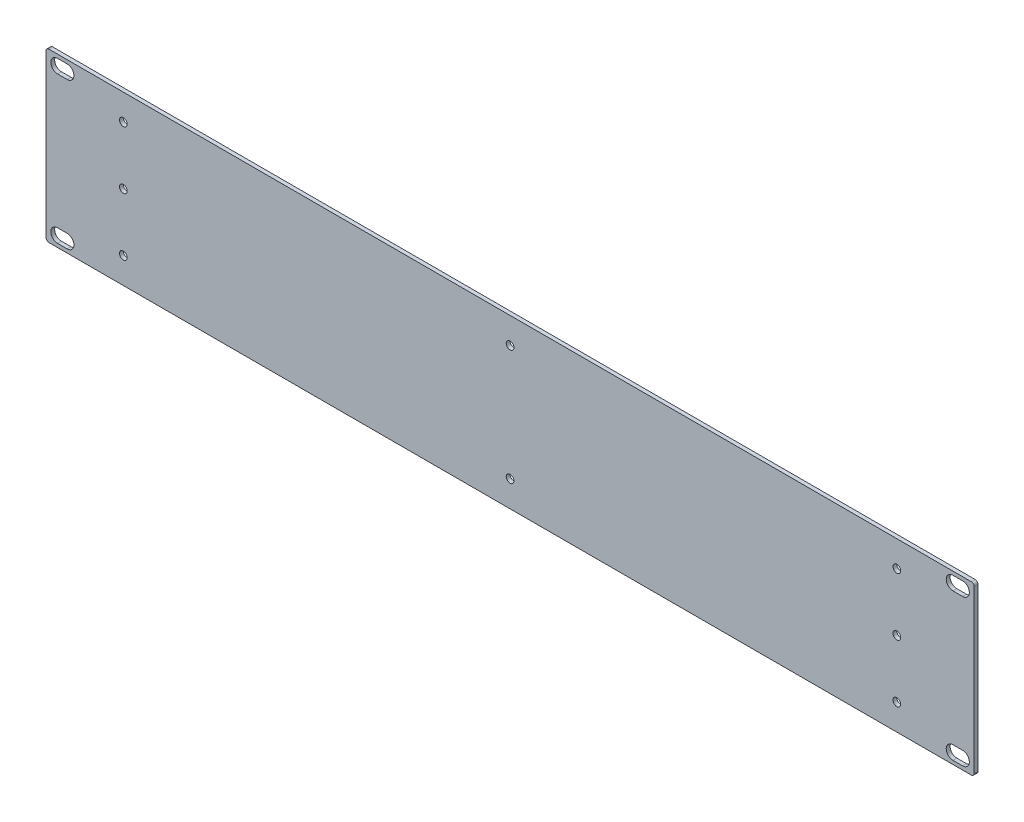
ISO-10303-21;
HEADER;
FILE_DESCRIPTION(('STEP AP214'),'2;1');
FILE_NAME('part.step','',(''),(''),'','','');
FILE_SCHEMA(('AUTOMOTIVE_DESIGN { 1 0 10303 214 1 1 1 1 }'));
ENDSEC;
DATA;
#1=APPLICATION_CONTEXT('core data for automotive mechanical design processes');
#2=APPLICATION_PROTOCOL_DEFINITION('international standard','automotive_design',2000,#1);
#3=PRODUCT_CONTEXT('',#1,'mechanical');
#4=PRODUCT('Part','Part','',(#3));
#5=PRODUCT_RELATED_PRODUCT_CATEGORY('part','',(#4));
#6=PRODUCT_DEFINITION_FORMATION('','',#4);
#7=PRODUCT_DEFINITION_CONTEXT('part definition',#1,'design');
#8=PRODUCT_DEFINITION('design','',#6,#7);
#9=PRODUCT_DEFINITION_SHAPE('','',#8);
#10=(LENGTH_UNIT() NAMED_UNIT(*) SI_UNIT(.MILLI.,.METRE.));
#11=(NAMED_UNIT(*) PLANE_ANGLE_UNIT() SI_UNIT($,.RADIAN.));
#12=(NAMED_UNIT(*) SI_UNIT($,.STERADIAN.) SOLID_ANGLE_UNIT());
#13=UNCERTAINTY_MEASURE_WITH_UNIT(LENGTH_MEASURE(1.E-05),#10,'distance_accuracy_value','');
#14=(GEOMETRIC_REPRESENTATION_CONTEXT(3) GLOBAL_UNCERTAINTY_ASSIGNED_CONTEXT((#13)) GLOBAL_UNIT_ASSIGNED_CONTEXT((#10,
#11,#12)) REPRESENTATION_CONTEXT('',''));
#15=CARTESIAN_POINT('',(0.,0.,0.));
#16=DIRECTION('',(0.,0.,1.));
#17=DIRECTION('',(1.,0.,0.));
#18=AXIS2_PLACEMENT_3D('',#15,#16,#17);
#19=CARTESIAN_POINT('',(0.,0.,2.));
#20=DIRECTION('',(0.,0.,1.));
#21=DIRECTION('',(1.,0.,0.));
#22=AXIS2_PLACEMENT_3D('',#19,#20,#21);
#23=PLANE('',#22);
#24=CARTESIAN_POINT('',(131.496341492358,-41.5622852256966,2.));
#25=DIRECTION('',(0.,0.,1.));
#26=DIRECTION('',(1.,0.,0.));
#27=AXIS2_PLACEMENT_3D('',#24,#25,#26);
#28=CIRCLE('',#27,2.);
#29=CARTESIAN_POINT('',(133.496341492358,-41.5622852256966,2.));
#30=VERTEX_POINT('',#29);
#31=EDGE_CURVE('E418',#30,#30,#28,.T.);
#32=ORIENTED_EDGE('',*,*,#31,.F.);
#33=EDGE_LOOP('',(#32));
#34=FACE_BOUND('',#33,.T.);
#35=CARTESIAN_POINT('',(131.496341492358,-11.5622852256966,2.));
#36=DIRECTION('',(0.,0.,1.));
#37=DIRECTION('',(1.,0.,0.));
#38=AXIS2_PLACEMENT_3D('',#35,#36,#37);
#39=CIRCLE('',#38,2.);
#40=CARTESIAN_POINT('',(133.496341492358,-11.5622852256966,2.));
#41=VERTEX_POINT('',#40);
#42=EDGE_CURVE('E424',#41,#41,#39,.T.);
#43=ORIENTED_EDGE('',*,*,#42,.F.);
#44=EDGE_LOOP('',(#43));
#45=FACE_BOUND('',#44,.T.);
#46=CARTESIAN_POINT('',(131.496341492358,18.4377147743035,2.));
#47=DIRECTION('',(0.,0.,1.));
#48=DIRECTION('',(1.,0.,0.));
#49=AXIS2_PLACEMENT_3D('',#46,#47,#48);
#50=CIRCLE('',#49,2.);
#51=CARTESIAN_POINT('',(133.496341492358,18.4377147743035,2.));
#52=VERTEX_POINT('',#51);
#53=EDGE_CURVE('E430',#52,#52,#50,.T.);
#54=ORIENTED_EDGE('',*,*,#53,.F.);
#55=EDGE_LOOP('',(#54));
#56=FACE_BOUND('',#55,.T.);
#57=CARTESIAN_POINT('',(-69.353658507642,-41.5622852256966,2.));
#58=DIRECTION('',(0.,0.,1.));
#59=DIRECTION('',(1.,0.,0.));
#60=AXIS2_PLACEMENT_3D('',#57,#58,#59);
#61=CIRCLE('',#60,2.);
#62=CARTESIAN_POINT('',(-67.353658507642,-41.5622852256966,2.));
#63=VERTEX_POINT('',#62);
#64=EDGE_CURVE('E436',#63,#63,#61,.T.);
#65=ORIENTED_EDGE('',*,*,#64,.F.);
#66=EDGE_LOOP('',(#65));
#67=FACE_BOUND('',#66,.T.);
#68=CARTESIAN_POINT('',(-69.353658507642,18.4377147743034,2.));
#69=DIRECTION('',(0.,0.,1.));
#70=DIRECTION('',(1.,0.,0.));
#71=AXIS2_PLACEMENT_3D('',#68,#69,#70);
#72=CIRCLE('',#71,2.);
#73=CARTESIAN_POINT('',(-67.353658507642,18.4377147743034,2.));
#74=VERTEX_POINT('',#73);
#75=EDGE_CURVE('E442',#74,#74,#72,.T.);
#76=ORIENTED_EDGE('',*,*,#75,.F.);
#77=EDGE_LOOP('',(#76));
#78=FACE_BOUND('',#77,.T.);
#79=CARTESIAN_POINT('',(-270.203658507642,-41.5622852256967,2.));
#80=DIRECTION('',(0.,0.,1.));
#81=DIRECTION('',(1.,0.,0.));
#82=AXIS2_PLACEMENT_3D('',#79,#80,#81);
#83=CIRCLE('',#82,2.);
#84=CARTESIAN_POINT('',(-268.203658507642,-41.5622852256967,2.));
#85=VERTEX_POINT('',#84);
#86=EDGE_CURVE('E448',#85,#85,#83,.T.);
#87=ORIENTED_EDGE('',*,*,#86,.F.);
#88=EDGE_LOOP('',(#87));
#89=FACE_BOUND('',#88,.T.);
#90=CARTESIAN_POINT('',(-270.203658507642,-11.5622852256966,2.));
#91=DIRECTION('',(0.,0.,1.));
#92=DIRECTION('',(1.,0.,0.));
#93=AXIS2_PLACEMENT_3D('',#90,#91,#92);
#94=CIRCLE('',#93,2.);
#95=CARTESIAN_POINT('',(-268.203658507642,-11.5622852256966,2.));
#96=VERTEX_POINT('',#95);
#97=EDGE_CURVE('E412',#96,#96,#94,.T.);
#98=ORIENTED_EDGE('',*,*,#97,.F.);
#99=EDGE_LOOP('',(#98));
#100=FACE_BOUND('',#99,.T.);
#101=CARTESIAN_POINT('',(-270.203658507642,18.4377147743034,2.));
#102=DIRECTION('',(0.,0.,1.));
#103=DIRECTION('',(1.,0.,0.));
#104=AXIS2_PLACEMENT_3D('',#101,#102,#103);
#105=CIRCLE('',#104,2.);
#106=CARTESIAN_POINT('',(-268.203658507642,18.4377147743034,2.));
#107=VERTEX_POINT('',#106);
#108=EDGE_CURVE('E409',#107,#107,#105,.T.);
#109=ORIENTED_EDGE('',*,*,#108,.F.);
#110=EDGE_LOOP('',(#109));
#111=FACE_BOUND('',#110,.T.);
#112=CARTESIAN_POINT('',(170.146341492358,30.4377147743034,2.));
#113=DIRECTION('',(0.,0.,1.));
#114=DIRECTION('',(1.,0.,0.));
#115=AXIS2_PLACEMENT_3D('',#112,#113,#114);
#116=CIRCLE('',#115,1.5);
#117=CARTESIAN_POINT('',(170.146341492358,31.9377147743034,2.));
#118=VERTEX_POINT('',#117);
#119=CARTESIAN_POINT('',(171.646341492358,30.4377147743034,2.));
#120=VERTEX_POINT('',#119);
#121=EDGE_CURVE('E318',#118,#120,#116,.F.);
#122=ORIENTED_EDGE('',*,*,#121,.F.);
#123=DIRECTION('',(-1.,0.,0.));
#124=VECTOR('',#123,1.);
#125=CARTESIAN_POINT('',(170.146341492358,31.9377147743034,2.));
#126=LINE('',#125,#124);
#127=CARTESIAN_POINT('',(-308.853658507642,31.9377147743034,2.));
#128=VERTEX_POINT('',#127);
#129=EDGE_CURVE('E207',#128,#118,#126,.F.);
#130=ORIENTED_EDGE('',*,*,#129,.F.);
#131=CARTESIAN_POINT('',(-308.853658507642,30.4377147743034,2.));
#132=DIRECTION('',(0.,0.,1.));
#133=DIRECTION('',(1.,0.,0.));
#134=AXIS2_PLACEMENT_3D('',#131,#132,#133);
#135=CIRCLE('',#134,1.5);
#136=CARTESIAN_POINT('',(-310.353658507642,30.4377147743034,2.));
#137=VERTEX_POINT('',#136);
#138=EDGE_CURVE('E38',#137,#128,#135,.F.);
#139=ORIENTED_EDGE('',*,*,#138,.F.);
#140=DIRECTION('',(0.,1.,0.));
#141=VECTOR('',#140,1.);
#142=CARTESIAN_POINT('',(-310.353658507642,30.4377147743034,2.));
#143=LINE('',#142,#141);
#144=CARTESIAN_POINT('',(-310.353658507642,-53.5622852256966,2.));
#145=VERTEX_POINT('',#144);
#146=EDGE_CURVE('E193',#145,#137,#143,.T.);
#147=ORIENTED_EDGE('',*,*,#146,.F.);
#148=CARTESIAN_POINT('',(-308.853658507642,-53.5622852256966,2.));
#149=DIRECTION('',(0.,0.,1.));
#150=DIRECTION('',(1.,0.,0.));
#151=AXIS2_PLACEMENT_3D('',#148,#149,#150);
#152=CIRCLE('',#151,1.5);
#153=CARTESIAN_POINT('',(-308.853658507642,-55.0622852256966,2.));
#154=VERTEX_POINT('',#153);
#155=EDGE_CURVE('E216',#154,#145,#152,.F.);
#156=ORIENTED_EDGE('',*,*,#155,.F.);
#157=DIRECTION('',(1.,0.,0.));
#158=VECTOR('',#157,1.);
#159=CARTESIAN_POINT('',(-308.853658507642,-55.0622852256966,2.));
#160=LINE('',#159,#158);
#161=CARTESIAN_POINT('',(170.146341492358,-55.0622852256966,2.));
#162=VERTEX_POINT('',#161);
#163=EDGE_CURVE('E328',#162,#154,#160,.F.);
#164=ORIENTED_EDGE('',*,*,#163,.F.);
#165=CARTESIAN_POINT('',(170.146341492358,-53.5622852256966,2.));
#166=DIRECTION('',(0.,0.,1.));
#167=DIRECTION('',(1.,0.,0.));
#168=AXIS2_PLACEMENT_3D('',#165,#166,#167);
#169=CIRCLE('',#168,1.5);
#170=CARTESIAN_POINT('',(171.646341492358,-53.5622852256966,2.));
#171=VERTEX_POINT('',#170);
#172=EDGE_CURVE('E325',#171,#162,#169,.F.);
#173=ORIENTED_EDGE('',*,*,#172,.F.);
#174=DIRECTION('',(0.,1.,0.));
#175=VECTOR('',#174,1.);
#176=CARTESIAN_POINT('',(171.646341492358,-53.5622852256966,2.));
#177=LINE('',#176,#175);
#178=EDGE_CURVE('E322',#120,#171,#177,.F.);
#179=ORIENTED_EDGE('',*,*,#178,.F.);
#180=EDGE_LOOP('',(#122,#130,#139,#147,#156,#164,#173,#179));
#181=FACE_BOUND('',#180,.T.);
#182=CARTESIAN_POINT('',(160.646341492358,26.5377147743033,2.));
#183=DIRECTION('',(0.,0.,1.));
#184=DIRECTION('',(1.,0.,0.));
#185=AXIS2_PLACEMENT_3D('',#182,#183,#184);
#186=CIRCLE('',#185,3.49999999999995);
#187=CARTESIAN_POINT('',(160.646341492358,23.0377147743034,2.));
#188=VERTEX_POINT('',#187);
#189=CARTESIAN_POINT('',(160.646341492358,30.0377147743033,2.));
#190=VERTEX_POINT('',#189);
#191=EDGE_CURVE('E297',#188,#190,#186,.F.);
#192=ORIENTED_EDGE('',*,*,#191,.T.);
#193=DIRECTION('',(1.,0.,0.));
#194=VECTOR('',#193,1.);
#195=CARTESIAN_POINT('',(0.,30.0377147743033,2.));
#196=LINE('',#195,#194);
#197=CARTESIAN_POINT('',(165.646341492358,30.0377147743033,2.));
#198=VERTEX_POINT('',#197);
#199=EDGE_CURVE('E293',#190,#198,#196,.T.);
#200=ORIENTED_EDGE('',*,*,#199,.T.);
#201=CARTESIAN_POINT('',(165.646341492358,26.5377147743033,2.));
#202=DIRECTION('',(0.,0.,1.));
#203=DIRECTION('',(1.,0.,0.));
#204=AXIS2_PLACEMENT_3D('',#201,#202,#203);
#205=CIRCLE('',#204,3.49999999999995);
#206=CARTESIAN_POINT('',(165.646341492358,23.0377147743034,2.));
#207=VERTEX_POINT('',#206);
#208=EDGE_CURVE('E289',#198,#207,#205,.F.);
#209=ORIENTED_EDGE('',*,*,#208,.T.);
#210=DIRECTION('',(1.,0.,0.));
#211=VECTOR('',#210,1.);
#212=CARTESIAN_POINT('',(0.,23.0377147743034,2.));
#213=LINE('',#212,#211);
#214=EDGE_CURVE('E300',#207,#188,#213,.F.);
#215=ORIENTED_EDGE('',*,*,#214,.T.);
#216=EDGE_LOOP('',(#192,#200,#209,#215));
#217=FACE_BOUND('',#216,.T.);
#218=CARTESIAN_POINT('',(165.646341492358,-49.6622852256966,2.));
#219=DIRECTION('',(0.,0.,1.));
#220=DIRECTION('',(1.,0.,0.));
#221=AXIS2_PLACEMENT_3D('',#218,#219,#220);
#222=CIRCLE('',#221,3.49999999999995);
#223=CARTESIAN_POINT('',(165.646341492358,-46.1622852256966,2.));
#224=VERTEX_POINT('',#223);
#225=CARTESIAN_POINT('',(165.646341492358,-53.1622852256965,2.));
#226=VERTEX_POINT('',#225);
#227=EDGE_CURVE('E271',#224,#226,#222,.F.);
#228=ORIENTED_EDGE('',*,*,#227,.T.);
#229=DIRECTION('',(1.,0.,0.));
#230=VECTOR('',#229,1.);
#231=CARTESIAN_POINT('',(0.,-53.1622852256965,2.));
#232=LINE('',#231,#230);
#233=CARTESIAN_POINT('',(160.646341492358,-53.1622852256965,2.));
#234=VERTEX_POINT('',#233);
#235=EDGE_CURVE('E267',#226,#234,#232,.F.);
#236=ORIENTED_EDGE('',*,*,#235,.T.);
#237=CARTESIAN_POINT('',(160.646341492358,-49.6622852256965,2.));
#238=DIRECTION('',(0.,0.,1.));
#239=DIRECTION('',(1.,0.,0.));
#240=AXIS2_PLACEMENT_3D('',#237,#238,#239);
#241=CIRCLE('',#240,3.49999999999995);
#242=CARTESIAN_POINT('',(160.646341492358,-46.1622852256966,2.));
#243=VERTEX_POINT('',#242);
#244=EDGE_CURVE('E264',#234,#243,#241,.F.);
#245=ORIENTED_EDGE('',*,*,#244,.T.);
#246=DIRECTION('',(1.,0.,0.));
#247=VECTOR('',#246,1.);
#248=CARTESIAN_POINT('',(0.,-46.1622852256966,2.));
#249=LINE('',#248,#247);
#250=EDGE_CURVE('E274',#243,#224,#249,.T.);
#251=ORIENTED_EDGE('',*,*,#250,.T.);
#252=EDGE_LOOP('',(#228,#236,#245,#251));
#253=FACE_BOUND('',#252,.T.);
#254=CARTESIAN_POINT('',(-299.353658507642,-49.6622852256966,2.));
#255=DIRECTION('',(0.,0.,1.));
#256=DIRECTION('',(1.,0.,0.));
#257=AXIS2_PLACEMENT_3D('',#254,#255,#256);
#258=CIRCLE('',#257,3.49999999999993);
#259=CARTESIAN_POINT('',(-299.353658507642,-46.1622852256966,2.));
#260=VERTEX_POINT('',#259);
#261=CARTESIAN_POINT('',(-299.353658507642,-53.1622852256965,2.));
#262=VERTEX_POINT('',#261);
#263=EDGE_CURVE('E284',#260,#262,#258,.F.);
#264=ORIENTED_EDGE('',*,*,#263,.T.);
#265=DIRECTION('',(1.,0.,0.));
#266=VECTOR('',#265,1.);
#267=CARTESIAN_POINT('',(0.,-53.1622852256965,2.));
#268=LINE('',#267,#266);
#269=CARTESIAN_POINT('',(-304.353658507642,-53.1622852256965,2.));
#270=VERTEX_POINT('',#269);
#271=EDGE_CURVE('E280',#262,#270,#268,.F.);
#272=ORIENTED_EDGE('',*,*,#271,.T.);
#273=CARTESIAN_POINT('',(-304.353658507642,-49.6622852256966,2.));
#274=DIRECTION('',(0.,0.,1.));
#275=DIRECTION('',(1.,0.,0.));
#276=AXIS2_PLACEMENT_3D('',#273,#274,#275);
#277=CIRCLE('',#276,3.49999999999993);
#278=CARTESIAN_POINT('',(-304.353658507642,-46.1622852256966,2.));
#279=VERTEX_POINT('',#278);
#280=EDGE_CURVE('E276',#270,#279,#277,.F.);
#281=ORIENTED_EDGE('',*,*,#280,.T.);
#282=DIRECTION('',(1.,0.,0.));
#283=VECTOR('',#282,1.);
#284=CARTESIAN_POINT('',(0.,-46.1622852256966,2.));
#285=LINE('',#284,#283);
#286=EDGE_CURVE('E287',#279,#260,#285,.T.);
#287=ORIENTED_EDGE('',*,*,#286,.T.);
#288=EDGE_LOOP('',(#264,#272,#281,#287));
#289=FACE_BOUND('',#288,.T.);
#290=DIRECTION('',(1.,0.,0.));
#291=VECTOR('',#290,1.);
#292=CARTESIAN_POINT('',(0.,30.0377147743034,2.));
#293=LINE('',#292,#291);
#294=CARTESIAN_POINT('',(-304.353658507642,30.0377147743034,2.));
#295=VERTEX_POINT('',#294);
#296=CARTESIAN_POINT('',(-299.353658507642,30.0377147743033,2.));
#297=VERTEX_POINT('',#296);
#298=EDGE_CURVE('E310',#295,#297,#293,.T.);
#299=ORIENTED_EDGE('',*,*,#298,.T.);
#300=CARTESIAN_POINT('',(-299.353658507642,26.5377147743033,2.));
#301=DIRECTION('',(0.,0.,1.));
#302=DIRECTION('',(1.,0.,0.));
#303=AXIS2_PLACEMENT_3D('',#300,#301,#302);
#304=CIRCLE('',#303,3.49999999999993);
#305=CARTESIAN_POINT('',(-299.353658507642,23.0377147743034,2.));
#306=VERTEX_POINT('',#305);
#307=EDGE_CURVE('E306',#297,#306,#304,.F.);
#308=ORIENTED_EDGE('',*,*,#307,.T.);
#309=DIRECTION('',(1.,0.,0.));
#310=VECTOR('',#309,1.);
#311=CARTESIAN_POINT('',(0.,23.0377147743034,2.));
#312=LINE('',#311,#310);
#313=CARTESIAN_POINT('',(-304.353658507642,23.0377147743034,2.));
#314=VERTEX_POINT('',#313);
#315=EDGE_CURVE('E302',#306,#314,#312,.F.);
#316=ORIENTED_EDGE('',*,*,#315,.T.);
#317=CARTESIAN_POINT('',(-304.353658507642,26.5377147743035,2.));
#318=DIRECTION('',(0.,0.,1.));
#319=DIRECTION('',(1.,0.,0.));
#320=AXIS2_PLACEMENT_3D('',#317,#318,#319);
#321=CIRCLE('',#320,3.49999999999993);
#322=EDGE_CURVE('E313',#314,#295,#321,.F.);
#323=ORIENTED_EDGE('',*,*,#322,.T.);
#324=EDGE_LOOP('',(#299,#308,#316,#323));
#325=FACE_BOUND('',#324,.T.);
#326=ADVANCED_FACE('F35',(#34,#45,#56,#67,#78,#89,#100,#111,#181,#217,#253,#289,#325),#23,.T.);
#327=CARTESIAN_POINT('',(-308.853658507642,30.4377147743034,0.));
#328=DIRECTION('',(0.,0.,1.));
#329=DIRECTION('',(1.,0.,0.));
#330=AXIS2_PLACEMENT_3D('',#327,#328,#329);
#331=CYLINDRICAL_SURFACE('',#330,1.5);
#332=ORIENTED_EDGE('',*,*,#138,.T.);
#333=DIRECTION('',(0.,0.,1.));
#334=VECTOR('',#333,1.);
#335=CARTESIAN_POINT('',(-308.853658507642,31.9377147743034,0.));
#336=LINE('',#335,#334);
#337=CARTESIAN_POINT('',(-308.853658507642,31.9377147743034,0.));
#338=VERTEX_POINT('',#337);
#339=EDGE_CURVE('E317',#338,#128,#336,.T.);
#340=ORIENTED_EDGE('',*,*,#339,.F.);
#341=CARTESIAN_POINT('',(-308.853658507642,30.4377147743034,0.));
#342=DIRECTION('',(0.,0.,1.));
#343=DIRECTION('',(1.,0.,0.));
#344=AXIS2_PLACEMENT_3D('',#341,#342,#343);
#345=CIRCLE('',#344,1.5);
#346=CARTESIAN_POINT('',(-310.353658507642,30.4377147743034,0.));
#347=VERTEX_POINT('',#346);
#348=EDGE_CURVE('E215',#338,#347,#345,.T.);
#349=ORIENTED_EDGE('',*,*,#348,.T.);
#350=DIRECTION('',(0.,0.,1.));
#351=VECTOR('',#350,1.);
#352=CARTESIAN_POINT('',(-310.353658507642,30.4377147743034,0.));
#353=LINE('',#352,#351);
#354=EDGE_CURVE('E198',#137,#347,#353,.F.);
#355=ORIENTED_EDGE('',*,*,#354,.F.);
#356=EDGE_LOOP('',(#332,#340,#349,#355));
#357=FACE_BOUND('',#356,.T.);
#358=ADVANCED_FACE('F213',(#357),#331,.T.);
#359=CARTESIAN_POINT('',(-310.353658507642,30.4377147743034,0.));
#360=DIRECTION('',(-1.,0.,0.));
#361=DIRECTION('',(0.,0.,1.));
#362=AXIS2_PLACEMENT_3D('',#359,#360,#361);
#363=PLANE('',#362);
#364=ORIENTED_EDGE('',*,*,#146,.T.);
#365=ORIENTED_EDGE('',*,*,#354,.T.);
#366=DIRECTION('',(0.,1.,0.));
#367=VECTOR('',#366,1.);
#368=CARTESIAN_POINT('',(-310.353658507642,0.,0.));
#369=LINE('',#368,#367);
#370=CARTESIAN_POINT('',(-310.353658507642,-53.5622852256966,0.));
#371=VERTEX_POINT('',#370);
#372=EDGE_CURVE('E262',#347,#371,#369,.F.);
#373=ORIENTED_EDGE('',*,*,#372,.T.);
#374=DIRECTION('',(0.,0.,1.));
#375=VECTOR('',#374,1.);
#376=CARTESIAN_POINT('',(-310.353658507642,-53.5622852256966,0.));
#377=LINE('',#376,#375);
#378=EDGE_CURVE('E200',#145,#371,#377,.F.);
#379=ORIENTED_EDGE('',*,*,#378,.F.);
#380=EDGE_LOOP('',(#364,#365,#373,#379));
#381=FACE_BOUND('',#380,.T.);
#382=ADVANCED_FACE('F195',(#381),#363,.T.);
#383=CARTESIAN_POINT('',(-308.853658507642,-53.5622852256966,0.));
#384=DIRECTION('',(0.,0.,1.));
#385=DIRECTION('',(1.,0.,0.));
#386=AXIS2_PLACEMENT_3D('',#383,#384,#385);
#387=CYLINDRICAL_SURFACE('',#386,1.5);
#388=ORIENTED_EDGE('',*,*,#155,.T.);
#389=ORIENTED_EDGE('',*,*,#378,.T.);
#390=CARTESIAN_POINT('',(-308.853658507642,-53.5622852256966,0.));
#391=DIRECTION('',(0.,0.,1.));
#392=DIRECTION('',(1.,0.,0.));
#393=AXIS2_PLACEMENT_3D('',#390,#391,#392);
#394=CIRCLE('',#393,1.5);
#395=CARTESIAN_POINT('',(-308.853658507642,-55.0622852256966,0.));
#396=VERTEX_POINT('',#395);
#397=EDGE_CURVE('E259',#371,#396,#394,.T.);
#398=ORIENTED_EDGE('',*,*,#397,.T.);
#399=DIRECTION('',(0.,0.,-1.));
#400=VECTOR('',#399,1.);
#401=CARTESIAN_POINT('',(-308.853658507642,-55.0622852256966,0.));
#402=LINE('',#401,#400);
#403=EDGE_CURVE('E327',#154,#396,#402,.T.);
#404=ORIENTED_EDGE('',*,*,#403,.F.);
#405=EDGE_LOOP('',(#388,#389,#398,#404));
#406=FACE_BOUND('',#405,.T.);
#407=ADVANCED_FACE('F334',(#406),#387,.T.);
#408=CARTESIAN_POINT('',(-308.853658507642,-55.0622852256966,0.));
#409=DIRECTION('',(0.,-1.,0.));
#410=DIRECTION('',(0.,0.,-1.));
#411=AXIS2_PLACEMENT_3D('',#408,#409,#410);
#412=PLANE('',#411);
#413=ORIENTED_EDGE('',*,*,#163,.T.);
#414=ORIENTED_EDGE('',*,*,#403,.T.);
#415=DIRECTION('',(1.,0.,0.));
#416=VECTOR('',#415,1.);
#417=CARTESIAN_POINT('',(0.,-55.0622852256966,0.));
#418=LINE('',#417,#416);
#419=CARTESIAN_POINT('',(170.146341492358,-55.0622852256966,0.));
#420=VERTEX_POINT('',#419);
#421=EDGE_CURVE('E258',#396,#420,#418,.T.);
#422=ORIENTED_EDGE('',*,*,#421,.T.);
#423=DIRECTION('',(0.,0.,1.));
#424=VECTOR('',#423,1.);
#425=CARTESIAN_POINT('',(170.146341492358,-55.0622852256966,0.));
#426=LINE('',#425,#424);
#427=EDGE_CURVE('E324',#162,#420,#426,.F.);
#428=ORIENTED_EDGE('',*,*,#427,.F.);
#429=EDGE_LOOP('',(#413,#414,#422,#428));
#430=FACE_BOUND('',#429,.T.);
#431=ADVANCED_FACE('F558',(#430),#412,.T.);
#432=CARTESIAN_POINT('',(170.146341492358,-53.5622852256966,0.));
#433=DIRECTION('',(0.,0.,1.));
#434=DIRECTION('',(1.,0.,0.));
#435=AXIS2_PLACEMENT_3D('',#432,#433,#434);
#436=CYLINDRICAL_SURFACE('',#435,1.5);
#437=ORIENTED_EDGE('',*,*,#172,.T.);
#438=ORIENTED_EDGE('',*,*,#427,.T.);
#439=CARTESIAN_POINT('',(170.146341492358,-53.5622852256966,0.));
#440=DIRECTION('',(0.,0.,1.));
#441=DIRECTION('',(1.,0.,0.));
#442=AXIS2_PLACEMENT_3D('',#439,#440,#441);
#443=CIRCLE('',#442,1.5);
#444=CARTESIAN_POINT('',(171.646341492358,-53.5622852256966,0.));
#445=VERTEX_POINT('',#444);
#446=EDGE_CURVE('E255',#420,#445,#443,.T.);
#447=ORIENTED_EDGE('',*,*,#446,.T.);
#448=DIRECTION('',(0.,0.,1.));
#449=VECTOR('',#448,1.);
#450=CARTESIAN_POINT('',(171.646341492358,-53.5622852256966,0.));
#451=LINE('',#450,#449);
#452=EDGE_CURVE('E321',#171,#445,#451,.F.);
#453=ORIENTED_EDGE('',*,*,#452,.F.);
#454=EDGE_LOOP('',(#437,#438,#447,#453));
#455=FACE_BOUND('',#454,.T.);
#456=ADVANCED_FACE('F382',(#455),#436,.T.);
#457=CARTESIAN_POINT('',(171.646341492358,-53.5622852256966,0.));
#458=DIRECTION('',(1.,0.,0.));
#459=DIRECTION('',(0.,1.,0.));
#460=AXIS2_PLACEMENT_3D('',#457,#458,#459);
#461=PLANE('',#460);
#462=ORIENTED_EDGE('',*,*,#178,.T.);
#463=ORIENTED_EDGE('',*,*,#452,.T.);
#464=DIRECTION('',(0.,1.,0.));
#465=VECTOR('',#464,1.);
#466=CARTESIAN_POINT('',(171.646341492358,0.,0.));
#467=LINE('',#466,#465);
#468=CARTESIAN_POINT('',(171.646341492358,30.4377147743034,0.));
#469=VERTEX_POINT('',#468);
#470=EDGE_CURVE('E254',#445,#469,#467,.T.);
#471=ORIENTED_EDGE('',*,*,#470,.T.);
#472=DIRECTION('',(0.,0.,1.));
#473=VECTOR('',#472,1.);
#474=CARTESIAN_POINT('',(171.646341492358,30.4377147743034,0.));
#475=LINE('',#474,#473);
#476=EDGE_CURVE('E320',#120,#469,#475,.F.);
#477=ORIENTED_EDGE('',*,*,#476,.F.);
#478=EDGE_LOOP('',(#462,#463,#471,#477));
#479=FACE_BOUND('',#478,.T.);
#480=ADVANCED_FACE('F552',(#479),#461,.T.);
#481=CARTESIAN_POINT('',(170.146341492358,30.4377147743034,0.));
#482=DIRECTION('',(0.,0.,1.));
#483=DIRECTION('',(1.,0.,0.));
#484=AXIS2_PLACEMENT_3D('',#481,#482,#483);
#485=CYLINDRICAL_SURFACE('',#484,1.5);
#486=ORIENTED_EDGE('',*,*,#121,.T.);
#487=ORIENTED_EDGE('',*,*,#476,.T.);
#488=CARTESIAN_POINT('',(170.146341492358,30.4377147743034,0.));
#489=DIRECTION('',(0.,0.,1.));
#490=DIRECTION('',(1.,0.,0.));
#491=AXIS2_PLACEMENT_3D('',#488,#489,#490);
#492=CIRCLE('',#491,1.5);
#493=CARTESIAN_POINT('',(170.146341492358,31.9377147743034,0.));
#494=VERTEX_POINT('',#493);
#495=EDGE_CURVE('E251',#469,#494,#492,.T.);
#496=ORIENTED_EDGE('',*,*,#495,.T.);
#497=DIRECTION('',(0.,0.,1.));
#498=VECTOR('',#497,1.);
#499=CARTESIAN_POINT('',(170.146341492358,31.9377147743034,0.));
#500=LINE('',#499,#498);
#501=EDGE_CURVE('E315',#118,#494,#500,.F.);
#502=ORIENTED_EDGE('',*,*,#501,.F.);
#503=EDGE_LOOP('',(#486,#487,#496,#502));
#504=FACE_BOUND('',#503,.T.);
#505=ADVANCED_FACE('F548',(#504),#485,.T.);
#506=CARTESIAN_POINT('',(170.146341492358,31.9377147743034,0.));
#507=DIRECTION('',(0.,1.,0.));
#508=DIRECTION('',(-1.,0.,0.));
#509=AXIS2_PLACEMENT_3D('',#506,#507,#508);
#510=PLANE('',#509);
#511=DIRECTION('',(1.,0.,0.));
#512=VECTOR('',#511,1.);
#513=CARTESIAN_POINT('',(0.,31.9377147743034,0.));
#514=LINE('',#513,#512);
#515=EDGE_CURVE('E250',#494,#338,#514,.F.);
#516=ORIENTED_EDGE('',*,*,#515,.T.);
#517=ORIENTED_EDGE('',*,*,#339,.T.);
#518=ORIENTED_EDGE('',*,*,#129,.T.);
#519=ORIENTED_EDGE('',*,*,#501,.T.);
#520=EDGE_LOOP('',(#516,#517,#518,#519));
#521=FACE_BOUND('',#520,.T.);
#522=ADVANCED_FACE('F544',(#521),#510,.T.);
#523=CARTESIAN_POINT('',(-304.353658507642,26.5377147743035,0.));
#524=DIRECTION('',(0.,0.,1.));
#525=DIRECTION('',(1.,0.,0.));
#526=AXIS2_PLACEMENT_3D('',#523,#524,#525);
#527=CYLINDRICAL_SURFACE('',#526,3.49999999999993);
#528=DIRECTION('',(0.,0.,-1.));
#529=VECTOR('',#528,1.);
#530=CARTESIAN_POINT('',(-304.353658507642,23.0377147743035,0.));
#531=LINE('',#530,#529);
#532=CARTESIAN_POINT('',(-304.353658507642,23.0377147743034,0.));
#533=VERTEX_POINT('',#532);
#534=EDGE_CURVE('E308',#314,#533,#531,.T.);
#535=ORIENTED_EDGE('',*,*,#534,.T.);
#536=CARTESIAN_POINT('',(-304.353658507642,26.5377147743035,0.));
#537=DIRECTION('',(0.,0.,1.));
#538=DIRECTION('',(1.,0.,0.));
#539=AXIS2_PLACEMENT_3D('',#536,#537,#538);
#540=CIRCLE('',#539,3.49999999999993);
#541=CARTESIAN_POINT('',(-304.353658507642,30.0377147743034,0.));
#542=VERTEX_POINT('',#541);
#543=EDGE_CURVE('E247',#533,#542,#540,.F.);
#544=ORIENTED_EDGE('',*,*,#543,.T.);
#545=DIRECTION('',(0.,0.,1.));
#546=VECTOR('',#545,1.);
#547=CARTESIAN_POINT('',(-304.353658507642,30.0377147743033,0.));
#548=LINE('',#547,#546);
#549=EDGE_CURVE('E312',#542,#295,#548,.T.);
#550=ORIENTED_EDGE('',*,*,#549,.T.);
#551=ORIENTED_EDGE('',*,*,#322,.F.);
#552=EDGE_LOOP('',(#535,#544,#550,#551));
#553=FACE_BOUND('',#552,.T.);
#554=ADVANCED_FACE('F540',(#553),#527,.F.);
#555=CARTESIAN_POINT('',(-299.353658507642,30.0377147743033,0.));
#556=DIRECTION('',(0.,1.,0.));
#557=DIRECTION('',(-1.,0.,0.));
#558=AXIS2_PLACEMENT_3D('',#555,#556,#557);
#559=PLANE('',#558);
#560=ORIENTED_EDGE('',*,*,#549,.F.);
#561=DIRECTION('',(1.,0.,0.));
#562=VECTOR('',#561,1.);
#563=CARTESIAN_POINT('',(0.,30.0377147743034,0.));
#564=LINE('',#563,#562);
#565=CARTESIAN_POINT('',(-299.353658507642,30.0377147743033,0.));
#566=VERTEX_POINT('',#565);
#567=EDGE_CURVE('E246',#542,#566,#564,.T.);
#568=ORIENTED_EDGE('',*,*,#567,.T.);
#569=DIRECTION('',(0.,0.,1.));
#570=VECTOR('',#569,1.);
#571=CARTESIAN_POINT('',(-299.353658507642,30.0377147743032,0.));
#572=LINE('',#571,#570);
#573=EDGE_CURVE('E309',#566,#297,#572,.T.);
#574=ORIENTED_EDGE('',*,*,#573,.T.);
#575=ORIENTED_EDGE('',*,*,#298,.F.);
#576=EDGE_LOOP('',(#560,#568,#574,#575));
#577=FACE_BOUND('',#576,.T.);
#578=ADVANCED_FACE('F536',(#577),#559,.F.);
#579=CARTESIAN_POINT('',(-299.353658507642,26.5377147743033,0.));
#580=DIRECTION('',(0.,0.,1.));
#581=DIRECTION('',(1.,0.,0.));
#582=AXIS2_PLACEMENT_3D('',#579,#580,#581);
#583=CYLINDRICAL_SURFACE('',#582,3.49999999999993);
#584=ORIENTED_EDGE('',*,*,#573,.F.);
#585=CARTESIAN_POINT('',(-299.353658507642,26.5377147743033,0.));
#586=DIRECTION('',(0.,0.,1.));
#587=DIRECTION('',(1.,0.,0.));
#588=AXIS2_PLACEMENT_3D('',#585,#586,#587);
#589=CIRCLE('',#588,3.49999999999993);
#590=CARTESIAN_POINT('',(-299.353658507642,23.0377147743034,0.));
#591=VERTEX_POINT('',#590);
#592=EDGE_CURVE('E242',#566,#591,#589,.F.);
#593=ORIENTED_EDGE('',*,*,#592,.T.);
#594=DIRECTION('',(0.,0.,-1.));
#595=VECTOR('',#594,1.);
#596=CARTESIAN_POINT('',(-299.353658507642,23.0377147743035,0.));
#597=LINE('',#596,#595);
#598=EDGE_CURVE('E305',#591,#306,#597,.F.);
#599=ORIENTED_EDGE('',*,*,#598,.T.);
#600=ORIENTED_EDGE('',*,*,#307,.F.);
#601=EDGE_LOOP('',(#584,#593,#599,#600));
#602=FACE_BOUND('',#601,.T.);
#603=ADVANCED_FACE('F532',(#602),#583,.F.);
#604=CARTESIAN_POINT('',(-304.353658507642,23.0377147743035,0.));
#605=DIRECTION('',(0.,-1.,0.));
#606=DIRECTION('',(0.,0.,-1.));
#607=AXIS2_PLACEMENT_3D('',#604,#605,#606);
#608=PLANE('',#607);
#609=ORIENTED_EDGE('',*,*,#598,.F.);
#610=DIRECTION('',(1.,0.,0.));
#611=VECTOR('',#610,1.);
#612=CARTESIAN_POINT('',(0.,23.0377147743034,0.));
#613=LINE('',#612,#611);
#614=EDGE_CURVE('E245',#591,#533,#613,.F.);
#615=ORIENTED_EDGE('',*,*,#614,.T.);
#616=ORIENTED_EDGE('',*,*,#534,.F.);
#617=ORIENTED_EDGE('',*,*,#315,.F.);
#618=EDGE_LOOP('',(#609,#615,#616,#617));
#619=FACE_BOUND('',#618,.T.);
#620=ADVANCED_FACE('F528',(#619),#608,.F.);
#621=CARTESIAN_POINT('',(160.646341492358,23.0377147743035,0.));
#622=DIRECTION('',(0.,-1.,0.));
#623=DIRECTION('',(0.,0.,-1.));
#624=AXIS2_PLACEMENT_3D('',#621,#622,#623);
#625=PLANE('',#624);
#626=DIRECTION('',(0.,0.,1.));
#627=VECTOR('',#626,1.);
#628=CARTESIAN_POINT('',(165.646341492358,23.0377147743033,0.));
#629=LINE('',#628,#627);
#630=CARTESIAN_POINT('',(165.646341492358,23.0377147743034,0.));
#631=VERTEX_POINT('',#630);
#632=EDGE_CURVE('E295',#207,#631,#629,.F.);
#633=ORIENTED_EDGE('',*,*,#632,.T.);
#634=DIRECTION('',(1.,0.,0.));
#635=VECTOR('',#634,1.);
#636=CARTESIAN_POINT('',(0.,23.0377147743034,0.));
#637=LINE('',#636,#635);
#638=CARTESIAN_POINT('',(160.646341492358,23.0377147743034,0.));
#639=VERTEX_POINT('',#638);
#640=EDGE_CURVE('E241',#631,#639,#637,.F.);
#641=ORIENTED_EDGE('',*,*,#640,.T.);
#642=DIRECTION('',(0.,0.,1.));
#643=VECTOR('',#642,1.);
#644=CARTESIAN_POINT('',(160.646341492358,23.0377147743033,0.));
#645=LINE('',#644,#643);
#646=EDGE_CURVE('E299',#639,#188,#645,.T.);
#647=ORIENTED_EDGE('',*,*,#646,.T.);
#648=ORIENTED_EDGE('',*,*,#214,.F.);
#649=EDGE_LOOP('',(#633,#641,#647,#648));
#650=FACE_BOUND('',#649,.T.);
#651=ADVANCED_FACE('F524',(#650),#625,.F.);
#652=CARTESIAN_POINT('',(160.646341492358,26.5377147743033,0.));
#653=DIRECTION('',(0.,0.,1.));
#654=DIRECTION('',(1.,0.,0.));
#655=AXIS2_PLACEMENT_3D('',#652,#653,#654);
#656=CYLINDRICAL_SURFACE('',#655,3.49999999999995);
#657=ORIENTED_EDGE('',*,*,#646,.F.);
#658=CARTESIAN_POINT('',(160.646341492358,26.5377147743033,0.));
#659=DIRECTION('',(0.,0.,1.));
#660=DIRECTION('',(1.,0.,0.));
#661=AXIS2_PLACEMENT_3D('',#658,#659,#660);
#662=CIRCLE('',#661,3.49999999999995);
#663=CARTESIAN_POINT('',(160.646341492358,30.0377147743033,0.));
#664=VERTEX_POINT('',#663);
#665=EDGE_CURVE('E238',#639,#664,#662,.F.);
#666=ORIENTED_EDGE('',*,*,#665,.T.);
#667=DIRECTION('',(0.,0.,1.));
#668=VECTOR('',#667,1.);
#669=CARTESIAN_POINT('',(160.646341492358,30.0377147743033,0.));
#670=LINE('',#669,#668);
#671=EDGE_CURVE('E296',#664,#190,#670,.T.);
#672=ORIENTED_EDGE('',*,*,#671,.T.);
#673=ORIENTED_EDGE('',*,*,#191,.F.);
#674=EDGE_LOOP('',(#657,#666,#672,#673));
#675=FACE_BOUND('',#674,.T.);
#676=ADVANCED_FACE('F520',(#675),#656,.F.);
#677=CARTESIAN_POINT('',(165.646341492358,30.0377147743033,0.));
#678=DIRECTION('',(0.,1.,0.));
#679=DIRECTION('',(0.,0.,1.));
#680=AXIS2_PLACEMENT_3D('',#677,#678,#679);
#681=PLANE('',#680);
#682=ORIENTED_EDGE('',*,*,#671,.F.);
#683=DIRECTION('',(1.,0.,0.));
#684=VECTOR('',#683,1.);
#685=CARTESIAN_POINT('',(0.,30.0377147743033,0.));
#686=LINE('',#685,#684);
#687=CARTESIAN_POINT('',(165.646341492358,30.0377147743033,0.));
#688=VERTEX_POINT('',#687);
#689=EDGE_CURVE('E237',#664,#688,#686,.T.);
#690=ORIENTED_EDGE('',*,*,#689,.T.);
#691=DIRECTION('',(0.,0.,1.));
#692=VECTOR('',#691,1.);
#693=CARTESIAN_POINT('',(165.646341492358,30.0377147743033,0.));
#694=LINE('',#693,#692);
#695=EDGE_CURVE('E292',#688,#198,#694,.T.);
#696=ORIENTED_EDGE('',*,*,#695,.T.);
#697=ORIENTED_EDGE('',*,*,#199,.F.);
#698=EDGE_LOOP('',(#682,#690,#696,#697));
#699=FACE_BOUND('',#698,.T.);
#700=ADVANCED_FACE('F516',(#699),#681,.F.);
#701=CARTESIAN_POINT('',(165.646341492358,26.5377147743033,0.));
#702=DIRECTION('',(0.,0.,1.));
#703=DIRECTION('',(1.,0.,0.));
#704=AXIS2_PLACEMENT_3D('',#701,#702,#703);
#705=CYLINDRICAL_SURFACE('',#704,3.49999999999995);
#706=ORIENTED_EDGE('',*,*,#695,.F.);
#707=CARTESIAN_POINT('',(165.646341492358,26.5377147743033,0.));
#708=DIRECTION('',(0.,0.,1.));
#709=DIRECTION('',(1.,0.,0.));
#710=AXIS2_PLACEMENT_3D('',#707,#708,#709);
#711=CIRCLE('',#710,3.49999999999995);
#712=EDGE_CURVE('E234',#688,#631,#711,.F.);
#713=ORIENTED_EDGE('',*,*,#712,.T.);
#714=ORIENTED_EDGE('',*,*,#632,.F.);
#715=ORIENTED_EDGE('',*,*,#208,.F.);
#716=EDGE_LOOP('',(#706,#713,#714,#715));
#717=FACE_BOUND('',#716,.T.);
#718=ADVANCED_FACE('F512',(#717),#705,.F.);
#719=CARTESIAN_POINT('',(-299.353658507642,-46.1622852256966,0.));
#720=DIRECTION('',(0.,1.,0.));
#721=DIRECTION('',(0.,0.,1.));
#722=AXIS2_PLACEMENT_3D('',#719,#720,#721);
#723=PLANE('',#722);
#724=DIRECTION('',(0.,0.,1.));
#725=VECTOR('',#724,1.);
#726=CARTESIAN_POINT('',(-304.353658507642,-46.1622852256967,0.));
#727=LINE('',#726,#725);
#728=CARTESIAN_POINT('',(-304.353658507642,-46.1622852256966,0.));
#729=VERTEX_POINT('',#728);
#730=EDGE_CURVE('E282',#279,#729,#727,.F.);
#731=ORIENTED_EDGE('',*,*,#730,.T.);
#732=DIRECTION('',(1.,0.,0.));
#733=VECTOR('',#732,1.);
#734=CARTESIAN_POINT('',(0.,-46.1622852256966,0.));
#735=LINE('',#734,#733);
#736=CARTESIAN_POINT('',(-299.353658507642,-46.1622852256966,0.));
#737=VERTEX_POINT('',#736);
#738=EDGE_CURVE('E233',#729,#737,#735,.T.);
#739=ORIENTED_EDGE('',*,*,#738,.T.);
#740=DIRECTION('',(0.,0.,1.));
#741=VECTOR('',#740,1.);
#742=CARTESIAN_POINT('',(-299.353658507642,-46.1622852256967,0.));
#743=LINE('',#742,#741);
#744=EDGE_CURVE('E286',#737,#260,#743,.T.);
#745=ORIENTED_EDGE('',*,*,#744,.T.);
#746=ORIENTED_EDGE('',*,*,#286,.F.);
#747=EDGE_LOOP('',(#731,#739,#745,#746));
#748=FACE_BOUND('',#747,.T.);
#749=ADVANCED_FACE('F508',(#748),#723,.F.);
#750=CARTESIAN_POINT('',(-299.353658507642,-49.6622852256966,0.));
#751=DIRECTION('',(0.,0.,1.));
#752=DIRECTION('',(1.,0.,0.));
#753=AXIS2_PLACEMENT_3D('',#750,#751,#752);
#754=CYLINDRICAL_SURFACE('',#753,3.49999999999993);
#755=ORIENTED_EDGE('',*,*,#744,.F.);
#756=CARTESIAN_POINT('',(-299.353658507642,-49.6622852256966,0.));
#757=DIRECTION('',(0.,0.,1.));
#758=DIRECTION('',(1.,0.,0.));
#759=AXIS2_PLACEMENT_3D('',#756,#757,#758);
#760=CIRCLE('',#759,3.49999999999993);
#761=CARTESIAN_POINT('',(-299.353658507642,-53.1622852256965,0.));
#762=VERTEX_POINT('',#761);
#763=EDGE_CURVE('E230',#737,#762,#760,.F.);
#764=ORIENTED_EDGE('',*,*,#763,.T.);
#765=DIRECTION('',(0.,0.,-1.));
#766=VECTOR('',#765,1.);
#767=CARTESIAN_POINT('',(-299.353658507642,-53.1622852256965,0.));
#768=LINE('',#767,#766);
#769=EDGE_CURVE('E283',#762,#262,#768,.F.);
#770=ORIENTED_EDGE('',*,*,#769,.T.);
#771=ORIENTED_EDGE('',*,*,#263,.F.);
#772=EDGE_LOOP('',(#755,#764,#770,#771));
#773=FACE_BOUND('',#772,.T.);
#774=ADVANCED_FACE('F504',(#773),#754,.F.);
#775=CARTESIAN_POINT('',(-304.353658507642,-53.1622852256965,0.));
#776=DIRECTION('',(0.,-1.,0.));
#777=DIRECTION('',(0.,0.,-1.));
#778=AXIS2_PLACEMENT_3D('',#775,#776,#777);
#779=PLANE('',#778);
#780=ORIENTED_EDGE('',*,*,#769,.F.);
#781=DIRECTION('',(1.,0.,0.));
#782=VECTOR('',#781,1.);
#783=CARTESIAN_POINT('',(0.,-53.1622852256965,0.));
#784=LINE('',#783,#782);
#785=CARTESIAN_POINT('',(-304.353658507642,-53.1622852256965,0.));
#786=VERTEX_POINT('',#785);
#787=EDGE_CURVE('E229',#762,#786,#784,.F.);
#788=ORIENTED_EDGE('',*,*,#787,.T.);
#789=DIRECTION('',(0.,0.,1.));
#790=VECTOR('',#789,1.);
#791=CARTESIAN_POINT('',(-304.353658507642,-53.1622852256965,0.));
#792=LINE('',#791,#790);
#793=EDGE_CURVE('E279',#786,#270,#792,.T.);
#794=ORIENTED_EDGE('',*,*,#793,.T.);
#795=ORIENTED_EDGE('',*,*,#271,.F.);
#796=EDGE_LOOP('',(#780,#788,#794,#795));
#797=FACE_BOUND('',#796,.T.);
#798=ADVANCED_FACE('F500',(#797),#779,.F.);
#799=CARTESIAN_POINT('',(-304.353658507642,-49.6622852256966,0.));
#800=DIRECTION('',(0.,0.,1.));
#801=DIRECTION('',(1.,0.,0.));
#802=AXIS2_PLACEMENT_3D('',#799,#800,#801);
#803=CYLINDRICAL_SURFACE('',#802,3.49999999999993);
#804=ORIENTED_EDGE('',*,*,#793,.F.);
#805=CARTESIAN_POINT('',(-304.353658507642,-49.6622852256966,0.));
#806=DIRECTION('',(0.,0.,1.));
#807=DIRECTION('',(1.,0.,0.));
#808=AXIS2_PLACEMENT_3D('',#805,#806,#807);
#809=CIRCLE('',#808,3.49999999999993);
#810=EDGE_CURVE('E226',#786,#729,#809,.F.);
#811=ORIENTED_EDGE('',*,*,#810,.T.);
#812=ORIENTED_EDGE('',*,*,#730,.F.);
#813=ORIENTED_EDGE('',*,*,#280,.F.);
#814=EDGE_LOOP('',(#804,#811,#812,#813));
#815=FACE_BOUND('',#814,.T.);
#816=ADVANCED_FACE('F496',(#815),#803,.F.);
#817=CARTESIAN_POINT('',(165.646341492358,-46.1622852256966,0.));
#818=DIRECTION('',(0.,1.,0.));
#819=DIRECTION('',(0.,0.,1.));
#820=AXIS2_PLACEMENT_3D('',#817,#818,#819);
#821=PLANE('',#820);
#822=DIRECTION('',(0.,0.,1.));
#823=VECTOR('',#822,1.);
#824=CARTESIAN_POINT('',(160.646341492358,-46.1622852256966,0.));
#825=LINE('',#824,#823);
#826=CARTESIAN_POINT('',(160.646341492358,-46.1622852256966,0.));
#827=VERTEX_POINT('',#826);
#828=EDGE_CURVE('E269',#243,#827,#825,.F.);
#829=ORIENTED_EDGE('',*,*,#828,.T.);
#830=DIRECTION('',(1.,0.,0.));
#831=VECTOR('',#830,1.);
#832=CARTESIAN_POINT('',(0.,-46.1622852256966,0.));
#833=LINE('',#832,#831);
#834=CARTESIAN_POINT('',(165.646341492358,-46.1622852256966,0.));
#835=VERTEX_POINT('',#834);
#836=EDGE_CURVE('E225',#827,#835,#833,.T.);
#837=ORIENTED_EDGE('',*,*,#836,.T.);
#838=DIRECTION('',(0.,0.,1.));
#839=VECTOR('',#838,1.);
#840=CARTESIAN_POINT('',(165.646341492358,-46.1622852256966,0.));
#841=LINE('',#840,#839);
#842=EDGE_CURVE('E273',#835,#224,#841,.T.);
#843=ORIENTED_EDGE('',*,*,#842,.T.);
#844=ORIENTED_EDGE('',*,*,#250,.F.);
#845=EDGE_LOOP('',(#829,#837,#843,#844));
#846=FACE_BOUND('',#845,.T.);
#847=ADVANCED_FACE('F492',(#846),#821,.F.);
#848=CARTESIAN_POINT('',(165.646341492358,-49.6622852256966,0.));
#849=DIRECTION('',(0.,0.,1.));
#850=DIRECTION('',(1.,0.,0.));
#851=AXIS2_PLACEMENT_3D('',#848,#849,#850);
#852=CYLINDRICAL_SURFACE('',#851,3.49999999999995);
#853=ORIENTED_EDGE('',*,*,#842,.F.);
#854=CARTESIAN_POINT('',(165.646341492358,-49.6622852256966,0.));
#855=DIRECTION('',(0.,0.,1.));
#856=DIRECTION('',(1.,0.,0.));
#857=AXIS2_PLACEMENT_3D('',#854,#855,#856);
#858=CIRCLE('',#857,3.49999999999995);
#859=CARTESIAN_POINT('',(165.646341492358,-53.1622852256965,0.));
#860=VERTEX_POINT('',#859);
#861=EDGE_CURVE('E222',#835,#860,#858,.F.);
#862=ORIENTED_EDGE('',*,*,#861,.T.);
#863=DIRECTION('',(0.,0.,-1.));
#864=VECTOR('',#863,1.);
#865=CARTESIAN_POINT('',(165.646341492358,-53.1622852256965,0.));
#866=LINE('',#865,#864);
#867=EDGE_CURVE('E270',#860,#226,#866,.F.);
#868=ORIENTED_EDGE('',*,*,#867,.T.);
#869=ORIENTED_EDGE('',*,*,#227,.F.);
#870=EDGE_LOOP('',(#853,#862,#868,#869));
#871=FACE_BOUND('',#870,.T.);
#872=ADVANCED_FACE('F488',(#871),#852,.F.);
#873=CARTESIAN_POINT('',(160.646341492358,-53.1622852256965,0.));
#874=DIRECTION('',(0.,-1.,0.));
#875=DIRECTION('',(0.,0.,-1.));
#876=AXIS2_PLACEMENT_3D('',#873,#874,#875);
#877=PLANE('',#876);
#878=ORIENTED_EDGE('',*,*,#867,.F.);
#879=DIRECTION('',(1.,0.,0.));
#880=VECTOR('',#879,1.);
#881=CARTESIAN_POINT('',(0.,-53.1622852256965,0.));
#882=LINE('',#881,#880);
#883=CARTESIAN_POINT('',(160.646341492358,-53.1622852256965,0.));
#884=VERTEX_POINT('',#883);
#885=EDGE_CURVE('E44',#860,#884,#882,.F.);
#886=ORIENTED_EDGE('',*,*,#885,.T.);
#887=DIRECTION('',(0.,0.,1.));
#888=VECTOR('',#887,1.);
#889=CARTESIAN_POINT('',(160.646341492358,-53.1622852256965,0.));
#890=LINE('',#889,#888);
#891=EDGE_CURVE('E52',#884,#234,#890,.T.);
#892=ORIENTED_EDGE('',*,*,#891,.T.);
#893=ORIENTED_EDGE('',*,*,#235,.F.);
#894=EDGE_LOOP('',(#878,#886,#892,#893));
#895=FACE_BOUND('',#894,.T.);
#896=ADVANCED_FACE('F485',(#895),#877,.F.);
#897=CARTESIAN_POINT('',(160.646341492358,-49.6622852256965,0.));
#898=DIRECTION('',(0.,0.,1.));
#899=DIRECTION('',(1.,0.,0.));
#900=AXIS2_PLACEMENT_3D('',#897,#898,#899);
#901=CYLINDRICAL_SURFACE('',#900,3.49999999999995);
#902=ORIENTED_EDGE('',*,*,#891,.F.);
#903=CARTESIAN_POINT('',(160.646341492358,-49.6622852256965,0.));
#904=DIRECTION('',(0.,0.,1.));
#905=DIRECTION('',(1.,0.,0.));
#906=AXIS2_PLACEMENT_3D('',#903,#904,#905);
#907=CIRCLE('',#906,3.49999999999995);
#908=EDGE_CURVE('E11',#884,#827,#907,.F.);
#909=ORIENTED_EDGE('',*,*,#908,.T.);
#910=ORIENTED_EDGE('',*,*,#828,.F.);
#911=ORIENTED_EDGE('',*,*,#244,.F.);
#912=EDGE_LOOP('',(#902,#909,#910,#911));
#913=FACE_BOUND('',#912,.T.);
#914=ADVANCED_FACE('F475',(#913),#901,.F.);
#915=CARTESIAN_POINT('',(0.,0.,0.));
#916=DIRECTION('',(0.,0.,1.));
#917=DIRECTION('',(1.,0.,0.));
#918=AXIS2_PLACEMENT_3D('',#915,#916,#917);
#919=PLANE('',#918);
#920=CARTESIAN_POINT('',(131.496341492358,-41.5622852256966,0.));
#921=DIRECTION('',(0.,0.,1.));
#922=DIRECTION('',(1.,0.,0.));
#923=AXIS2_PLACEMENT_3D('',#920,#921,#922);
#924=CIRCLE('',#923,2.);
#925=CARTESIAN_POINT('',(133.496341492358,-41.5622852256966,0.));
#926=VERTEX_POINT('',#925);
#927=EDGE_CURVE('E415',#926,#926,#924,.T.);
#928=ORIENTED_EDGE('',*,*,#927,.T.);
#929=EDGE_LOOP('',(#928));
#930=FACE_BOUND('',#929,.T.);
#931=CARTESIAN_POINT('',(131.496341492358,-11.5622852256966,0.));
#932=DIRECTION('',(0.,0.,1.));
#933=DIRECTION('',(1.,0.,0.));
#934=AXIS2_PLACEMENT_3D('',#931,#932,#933);
#935=CIRCLE('',#934,2.);
#936=CARTESIAN_POINT('',(133.496341492358,-11.5622852256966,0.));
#937=VERTEX_POINT('',#936);
#938=EDGE_CURVE('E421',#937,#937,#935,.T.);
#939=ORIENTED_EDGE('',*,*,#938,.T.);
#940=EDGE_LOOP('',(#939));
#941=FACE_BOUND('',#940,.T.);
#942=CARTESIAN_POINT('',(131.496341492358,18.4377147743035,0.));
#943=DIRECTION('',(0.,0.,1.));
#944=DIRECTION('',(1.,0.,0.));
#945=AXIS2_PLACEMENT_3D('',#942,#943,#944);
#946=CIRCLE('',#945,2.);
#947=CARTESIAN_POINT('',(133.496341492358,18.4377147743035,0.));
#948=VERTEX_POINT('',#947);
#949=EDGE_CURVE('E427',#948,#948,#946,.T.);
#950=ORIENTED_EDGE('',*,*,#949,.T.);
#951=EDGE_LOOP('',(#950));
#952=FACE_BOUND('',#951,.T.);
#953=CARTESIAN_POINT('',(-69.353658507642,-41.5622852256966,0.));
#954=DIRECTION('',(0.,0.,1.));
#955=DIRECTION('',(1.,0.,0.));
#956=AXIS2_PLACEMENT_3D('',#953,#954,#955);
#957=CIRCLE('',#956,2.);
#958=CARTESIAN_POINT('',(-67.353658507642,-41.5622852256966,0.));
#959=VERTEX_POINT('',#958);
#960=EDGE_CURVE('E433',#959,#959,#957,.T.);
#961=ORIENTED_EDGE('',*,*,#960,.T.);
#962=EDGE_LOOP('',(#961));
#963=FACE_BOUND('',#962,.T.);
#964=CARTESIAN_POINT('',(-69.353658507642,18.4377147743034,0.));
#965=DIRECTION('',(0.,0.,1.));
#966=DIRECTION('',(1.,0.,0.));
#967=AXIS2_PLACEMENT_3D('',#964,#965,#966);
#968=CIRCLE('',#967,2.);
#969=CARTESIAN_POINT('',(-67.353658507642,18.4377147743034,0.));
#970=VERTEX_POINT('',#969);
#971=EDGE_CURVE('E439',#970,#970,#968,.T.);
#972=ORIENTED_EDGE('',*,*,#971,.T.);
#973=EDGE_LOOP('',(#972));
#974=FACE_BOUND('',#973,.T.);
#975=CARTESIAN_POINT('',(-270.203658507642,-41.5622852256967,0.));
#976=DIRECTION('',(0.,0.,1.));
#977=DIRECTION('',(1.,0.,0.));
#978=AXIS2_PLACEMENT_3D('',#975,#976,#977);
#979=CIRCLE('',#978,2.);
#980=CARTESIAN_POINT('',(-268.203658507642,-41.5622852256967,0.));
#981=VERTEX_POINT('',#980);
#982=EDGE_CURVE('E445',#981,#981,#979,.T.);
#983=ORIENTED_EDGE('',*,*,#982,.T.);
#984=EDGE_LOOP('',(#983));
#985=FACE_BOUND('',#984,.T.);
#986=CARTESIAN_POINT('',(-270.203658507642,-11.5622852256966,0.));
#987=DIRECTION('',(0.,0.,1.));
#988=DIRECTION('',(1.,0.,0.));
#989=AXIS2_PLACEMENT_3D('',#986,#987,#988);
#990=CIRCLE('',#989,2.);
#991=CARTESIAN_POINT('',(-268.203658507642,-11.5622852256966,0.));
#992=VERTEX_POINT('',#991);
#993=EDGE_CURVE('E451',#992,#992,#990,.T.);
#994=ORIENTED_EDGE('',*,*,#993,.T.);
#995=EDGE_LOOP('',(#994));
#996=FACE_BOUND('',#995,.T.);
#997=CARTESIAN_POINT('',(-270.203658507642,18.4377147743034,0.));
#998=DIRECTION('',(0.,0.,1.));
#999=DIRECTION('',(1.,0.,0.));
#1000=AXIS2_PLACEMENT_3D('',#997,#998,#999);
#1001=CIRCLE('',#1000,2.);
#1002=CARTESIAN_POINT('',(-268.203658507642,18.4377147743034,0.));
#1003=VERTEX_POINT('',#1002);
#1004=EDGE_CURVE('E211',#1003,#1003,#1001,.T.);
#1005=ORIENTED_EDGE('',*,*,#1004,.T.);
#1006=EDGE_LOOP('',(#1005));
#1007=FACE_BOUND('',#1006,.T.);
#1008=ORIENTED_EDGE('',*,*,#885,.F.);
#1009=ORIENTED_EDGE('',*,*,#861,.F.);
#1010=ORIENTED_EDGE('',*,*,#836,.F.);
#1011=ORIENTED_EDGE('',*,*,#908,.F.);
#1012=EDGE_LOOP('',(#1008,#1009,#1010,#1011));
#1013=FACE_BOUND('',#1012,.T.);
#1014=ORIENTED_EDGE('',*,*,#689,.F.);
#1015=ORIENTED_EDGE('',*,*,#665,.F.);
#1016=ORIENTED_EDGE('',*,*,#640,.F.);
#1017=ORIENTED_EDGE('',*,*,#712,.F.);
#1018=EDGE_LOOP('',(#1014,#1015,#1016,#1017));
#1019=FACE_BOUND('',#1018,.T.);
#1020=ORIENTED_EDGE('',*,*,#446,.F.);
#1021=ORIENTED_EDGE('',*,*,#421,.F.);
#1022=ORIENTED_EDGE('',*,*,#397,.F.);
#1023=ORIENTED_EDGE('',*,*,#372,.F.);
#1024=ORIENTED_EDGE('',*,*,#348,.F.);
#1025=ORIENTED_EDGE('',*,*,#515,.F.);
#1026=ORIENTED_EDGE('',*,*,#495,.F.);
#1027=ORIENTED_EDGE('',*,*,#470,.F.);
#1028=EDGE_LOOP('',(#1020,#1021,#1022,#1023,#1024,#1025,#1026,#1027));
#1029=FACE_BOUND('',#1028,.T.);
#1030=ORIENTED_EDGE('',*,*,#592,.F.);
#1031=ORIENTED_EDGE('',*,*,#567,.F.);
#1032=ORIENTED_EDGE('',*,*,#543,.F.);
#1033=ORIENTED_EDGE('',*,*,#614,.F.);
#1034=EDGE_LOOP('',(#1030,#1031,#1032,#1033));
#1035=FACE_BOUND('',#1034,.T.);
#1036=ORIENTED_EDGE('',*,*,#787,.F.);
#1037=ORIENTED_EDGE('',*,*,#763,.F.);
#1038=ORIENTED_EDGE('',*,*,#738,.F.);
#1039=ORIENTED_EDGE('',*,*,#810,.F.);
#1040=EDGE_LOOP('',(#1036,#1037,#1038,#1039));
#1041=FACE_BOUND('',#1040,.T.);
#1042=ADVANCED_FACE('F339',(#930,#941,#952,#963,#974,#985,#996,#1007,#1013,#1019,#1029,#1035,
#1041),#919,.F.);
#1043=CARTESIAN_POINT('',(-270.203658507642,18.4377147743034,0.));
#1044=DIRECTION('',(0.,0.,1.));
#1045=DIRECTION('',(1.,0.,0.));
#1046=AXIS2_PLACEMENT_3D('',#1043,#1044,#1045);
#1047=CYLINDRICAL_SURFACE('',#1046,2.);
#1048=ORIENTED_EDGE('',*,*,#1004,.F.);
#1049=EDGE_LOOP('',(#1048));
#1050=FACE_BOUND('',#1049,.T.);
#1051=ORIENTED_EDGE('',*,*,#108,.T.);
#1052=EDGE_LOOP('',(#1051));
#1053=FACE_BOUND('',#1052,.T.);
#1054=ADVANCED_FACE('F462',(#1050,#1053),#1047,.F.);
#1055=CARTESIAN_POINT('',(-270.203658507642,-11.5622852256966,0.));
#1056=DIRECTION('',(0.,0.,1.));
#1057=DIRECTION('',(1.,0.,0.));
#1058=AXIS2_PLACEMENT_3D('',#1055,#1056,#1057);
#1059=CYLINDRICAL_SURFACE('',#1058,2.);
#1060=ORIENTED_EDGE('',*,*,#993,.F.);
#1061=EDGE_LOOP('',(#1060));
#1062=FACE_BOUND('',#1061,.T.);
#1063=ORIENTED_EDGE('',*,*,#97,.T.);
#1064=EDGE_LOOP('',(#1063));
#1065=FACE_BOUND('',#1064,.T.);
#1066=ADVANCED_FACE('F457',(#1062,#1065),#1059,.F.);
#1067=CARTESIAN_POINT('',(-270.203658507642,-41.5622852256967,0.));
#1068=DIRECTION('',(0.,0.,1.));
#1069=DIRECTION('',(1.,0.,0.));
#1070=AXIS2_PLACEMENT_3D('',#1067,#1068,#1069);
#1071=CYLINDRICAL_SURFACE('',#1070,2.);
#1072=ORIENTED_EDGE('',*,*,#982,.F.);
#1073=EDGE_LOOP('',(#1072));
#1074=FACE_BOUND('',#1073,.T.);
#1075=ORIENTED_EDGE('',*,*,#86,.T.);
#1076=EDGE_LOOP('',(#1075));
#1077=FACE_BOUND('',#1076,.T.);
#1078=ADVANCED_FACE('F472',(#1074,#1077),#1071,.F.);
#1079=CARTESIAN_POINT('',(-69.353658507642,18.4377147743034,0.));
#1080=DIRECTION('',(0.,0.,1.));
#1081=DIRECTION('',(1.,0.,0.));
#1082=AXIS2_PLACEMENT_3D('',#1079,#1080,#1081);
#1083=CYLINDRICAL_SURFACE('',#1082,2.);
#1084=ORIENTED_EDGE('',*,*,#971,.F.);
#1085=EDGE_LOOP('',(#1084));
#1086=FACE_BOUND('',#1085,.T.);
#1087=ORIENTED_EDGE('',*,*,#75,.T.);
#1088=EDGE_LOOP('',(#1087));
#1089=FACE_BOUND('',#1088,.T.);
#1090=ADVANCED_FACE('F803',(#1086,#1089),#1083,.F.);
#1091=CARTESIAN_POINT('',(-69.353658507642,-41.5622852256966,0.));
#1092=DIRECTION('',(0.,0.,1.));
#1093=DIRECTION('',(1.,0.,0.));
#1094=AXIS2_PLACEMENT_3D('',#1091,#1092,#1093);
#1095=CYLINDRICAL_SURFACE('',#1094,2.);
#1096=ORIENTED_EDGE('',*,*,#960,.F.);
#1097=EDGE_LOOP('',(#1096));
#1098=FACE_BOUND('',#1097,.T.);
#1099=ORIENTED_EDGE('',*,*,#64,.T.);
#1100=EDGE_LOOP('',(#1099));
#1101=FACE_BOUND('',#1100,.T.);
#1102=ADVANCED_FACE('F812',(#1098,#1101),#1095,.F.);
#1103=CARTESIAN_POINT('',(131.496341492358,18.4377147743035,0.));
#1104=DIRECTION('',(0.,0.,1.));
#1105=DIRECTION('',(1.,0.,0.));
#1106=AXIS2_PLACEMENT_3D('',#1103,#1104,#1105);
#1107=CYLINDRICAL_SURFACE('',#1106,2.);
#1108=ORIENTED_EDGE('',*,*,#949,.F.);
#1109=EDGE_LOOP('',(#1108));
#1110=FACE_BOUND('',#1109,.T.);
#1111=ORIENTED_EDGE('',*,*,#53,.T.);
#1112=EDGE_LOOP('',(#1111));
#1113=FACE_BOUND('',#1112,.T.);
#1114=ADVANCED_FACE('F821',(#1110,#1113),#1107,.F.);
#1115=CARTESIAN_POINT('',(131.496341492358,-11.5622852256966,0.));
#1116=DIRECTION('',(0.,0.,1.));
#1117=DIRECTION('',(1.,0.,0.));
#1118=AXIS2_PLACEMENT_3D('',#1115,#1116,#1117);
#1119=CYLINDRICAL_SURFACE('',#1118,2.);
#1120=ORIENTED_EDGE('',*,*,#938,.F.);
#1121=EDGE_LOOP('',(#1120));
#1122=FACE_BOUND('',#1121,.T.);
#1123=ORIENTED_EDGE('',*,*,#42,.T.);
#1124=EDGE_LOOP('',(#1123));
#1125=FACE_BOUND('',#1124,.T.);
#1126=ADVANCED_FACE('F830',(#1122,#1125),#1119,.F.);
#1127=CARTESIAN_POINT('',(131.496341492358,-41.5622852256966,0.));
#1128=DIRECTION('',(0.,0.,1.));
#1129=DIRECTION('',(1.,0.,0.));
#1130=AXIS2_PLACEMENT_3D('',#1127,#1128,#1129);
#1131=CYLINDRICAL_SURFACE('',#1130,2.);
#1132=ORIENTED_EDGE('',*,*,#927,.F.);
#1133=EDGE_LOOP('',(#1132));
#1134=FACE_BOUND('',#1133,.T.);
#1135=ORIENTED_EDGE('',*,*,#31,.T.);
#1136=EDGE_LOOP('',(#1135));
#1137=FACE_BOUND('',#1136,.T.);
#1138=ADVANCED_FACE('F480',(#1134,#1137),#1131,.F.);
#1139=CLOSED_SHELL('',(#326,#358,#382,#407,#431,#456,#480,#505,#522,#554,#578,#603,#620,#651,
#676,#700,#718,#749,#774,#798,#816,#847,#872,#896,#914,#1042,#1054,#1066,#1078,#1090,#1102,
#1114,#1126,#1138));
#1140=MANIFOLD_SOLID_BREP('B2',#1139);
#1141=ADVANCED_BREP_SHAPE_REPRESENTATION('',(#18,#1140),#14);
#1142=SHAPE_DEFINITION_REPRESENTATION(#9,#1141);
ENDSEC;
END-ISO-10303-21;
